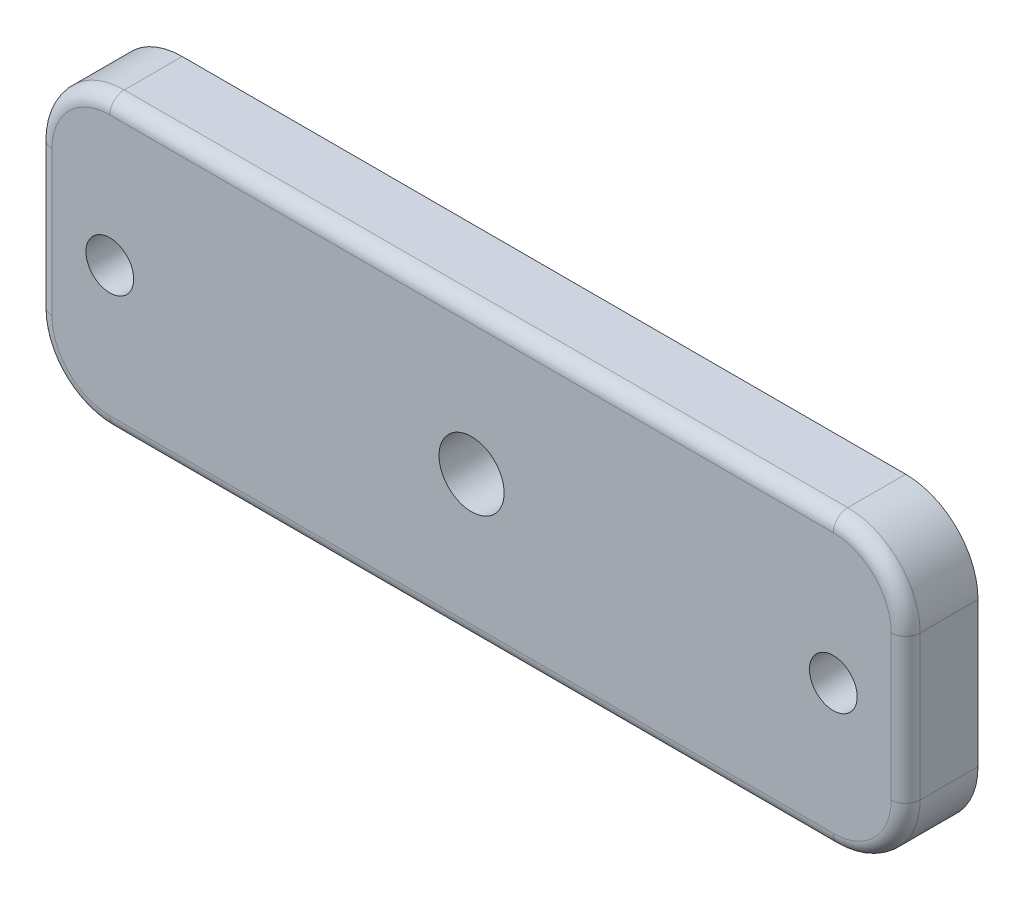
ISO-10303-21;
HEADER;
FILE_DESCRIPTION(('STEP AP214'),'2;1');
FILE_NAME('part.step','',(''),(''),'','','');
FILE_SCHEMA(('AUTOMOTIVE_DESIGN { 1 0 10303 214 1 1 1 1 }'));
ENDSEC;
DATA;
#1=APPLICATION_CONTEXT('core data for automotive mechanical design processes');
#2=APPLICATION_PROTOCOL_DEFINITION('international standard','automotive_design',2000,#1);
#3=PRODUCT_CONTEXT('',#1,'mechanical');
#4=PRODUCT('Part','Part','',(#3));
#5=PRODUCT_RELATED_PRODUCT_CATEGORY('part','',(#4));
#6=PRODUCT_DEFINITION_FORMATION('','',#4);
#7=PRODUCT_DEFINITION_CONTEXT('part definition',#1,'design');
#8=PRODUCT_DEFINITION('design','',#6,#7);
#9=PRODUCT_DEFINITION_SHAPE('','',#8);
#10=(LENGTH_UNIT() NAMED_UNIT(*) SI_UNIT(.MILLI.,.METRE.));
#11=(NAMED_UNIT(*) PLANE_ANGLE_UNIT() SI_UNIT($,.RADIAN.));
#12=(NAMED_UNIT(*) SI_UNIT($,.STERADIAN.) SOLID_ANGLE_UNIT());
#13=UNCERTAINTY_MEASURE_WITH_UNIT(LENGTH_MEASURE(1.E-05),#10,'distance_accuracy_value','');
#14=(GEOMETRIC_REPRESENTATION_CONTEXT(3) GLOBAL_UNCERTAINTY_ASSIGNED_CONTEXT((#13)) GLOBAL_UNIT_ASSIGNED_CONTEXT((#10,
#11,#12)) REPRESENTATION_CONTEXT('',''));
#15=CARTESIAN_POINT('',(0.,0.,0.));
#16=DIRECTION('',(0.,0.,1.));
#17=DIRECTION('',(1.,0.,0.));
#18=AXIS2_PLACEMENT_3D('',#15,#16,#17);
#19=CARTESIAN_POINT('',(0.,0.,5.));
#20=DIRECTION('',(0.,0.,-1.));
#21=DIRECTION('',(-1.,0.,0.));
#22=AXIS2_PLACEMENT_3D('',#19,#20,#21);
#23=PLANE('',#22);
#24=CARTESIAN_POINT('',(0.,-10.,5.));
#25=DIRECTION('',(0.,0.,1.));
#26=DIRECTION('',(1.,0.,0.));
#27=AXIS2_PLACEMENT_3D('',#24,#25,#26);
#28=CIRCLE('',#27,2.25);
#29=CARTESIAN_POINT('',(2.25,-10.,5.));
#30=VERTEX_POINT('',#29);
#31=EDGE_CURVE('E325',#30,#30,#28,.T.);
#32=ORIENTED_EDGE('',*,*,#31,.F.);
#33=EDGE_LOOP('',(#32));
#34=FACE_BOUND('',#33,.T.);
#35=CARTESIAN_POINT('',(25.,-10.,5.));
#36=DIRECTION('',(0.,0.,1.));
#37=DIRECTION('',(1.,0.,0.));
#38=AXIS2_PLACEMENT_3D('',#35,#36,#37);
#39=CIRCLE('',#38,1.65);
#40=CARTESIAN_POINT('',(26.65,-10.,5.));
#41=VERTEX_POINT('',#40);
#42=EDGE_CURVE('E332',#41,#41,#39,.T.);
#43=ORIENTED_EDGE('',*,*,#42,.F.);
#44=EDGE_LOOP('',(#43));
#45=FACE_BOUND('',#44,.T.);
#46=CARTESIAN_POINT('',(-25.,-10.,5.));
#47=DIRECTION('',(0.,0.,1.));
#48=DIRECTION('',(1.,0.,0.));
#49=AXIS2_PLACEMENT_3D('',#46,#47,#48);
#50=CIRCLE('',#49,1.65);
#51=CARTESIAN_POINT('',(-23.35,-10.,5.));
#52=VERTEX_POINT('',#51);
#53=EDGE_CURVE('E337',#52,#52,#50,.T.);
#54=ORIENTED_EDGE('',*,*,#53,.F.);
#55=EDGE_LOOP('',(#54));
#56=FACE_BOUND('',#55,.T.);
#57=CARTESIAN_POINT('',(25.,-4.99999999999999,5.));
#58=DIRECTION('',(0.,0.,-1.));
#59=DIRECTION('',(-1.,0.,0.));
#60=AXIS2_PLACEMENT_3D('',#57,#58,#59);
#61=CIRCLE('',#60,4.);
#62=CARTESIAN_POINT('',(25.,-0.99999999999999,5.));
#63=VERTEX_POINT('',#62);
#64=CARTESIAN_POINT('',(29.,-4.99999999999999,5.));
#65=VERTEX_POINT('',#64);
#66=EDGE_CURVE('E244',#63,#65,#61,.T.);
#67=ORIENTED_EDGE('',*,*,#66,.F.);
#68=DIRECTION('',(-1.,0.,0.));
#69=VECTOR('',#68,1.);
#70=CARTESIAN_POINT('',(0.,-0.999999999999995,5.));
#71=LINE('',#70,#69);
#72=CARTESIAN_POINT('',(-25.,-0.999999999999999,5.));
#73=VERTEX_POINT('',#72);
#74=EDGE_CURVE('E139',#63,#73,#71,.T.);
#75=ORIENTED_EDGE('',*,*,#74,.T.);
#76=CARTESIAN_POINT('',(-25.,-5.,5.));
#77=DIRECTION('',(0.,0.,-1.));
#78=DIRECTION('',(-1.,0.,0.));
#79=AXIS2_PLACEMENT_3D('',#76,#77,#78);
#80=CIRCLE('',#79,4.);
#81=CARTESIAN_POINT('',(-29.,-5.,5.));
#82=VERTEX_POINT('',#81);
#83=EDGE_CURVE('E134',#82,#73,#80,.T.);
#84=ORIENTED_EDGE('',*,*,#83,.F.);
#85=DIRECTION('',(0.,-1.,0.));
#86=VECTOR('',#85,1.);
#87=CARTESIAN_POINT('',(-29.,0.,5.));
#88=LINE('',#87,#86);
#89=CARTESIAN_POINT('',(-29.,-15.,5.));
#90=VERTEX_POINT('',#89);
#91=EDGE_CURVE('E137',#82,#90,#88,.T.);
#92=ORIENTED_EDGE('',*,*,#91,.T.);
#93=CARTESIAN_POINT('',(-25.,-15.,5.));
#94=DIRECTION('',(0.,0.,-1.));
#95=DIRECTION('',(-1.,0.,0.));
#96=AXIS2_PLACEMENT_3D('',#93,#94,#95);
#97=CIRCLE('',#96,4.);
#98=CARTESIAN_POINT('',(-25.,-19.,5.));
#99=VERTEX_POINT('',#98);
#100=EDGE_CURVE('E144',#99,#90,#97,.T.);
#101=ORIENTED_EDGE('',*,*,#100,.F.);
#102=DIRECTION('',(1.,0.,0.));
#103=VECTOR('',#102,1.);
#104=CARTESIAN_POINT('',(0.,-19.,5.));
#105=LINE('',#104,#103);
#106=CARTESIAN_POINT('',(25.,-19.,5.));
#107=VERTEX_POINT('',#106);
#108=EDGE_CURVE('E155',#99,#107,#105,.T.);
#109=ORIENTED_EDGE('',*,*,#108,.T.);
#110=CARTESIAN_POINT('',(25.,-15.,5.));
#111=DIRECTION('',(0.,0.,-1.));
#112=DIRECTION('',(-1.,0.,0.));
#113=AXIS2_PLACEMENT_3D('',#110,#111,#112);
#114=CIRCLE('',#113,4.);
#115=CARTESIAN_POINT('',(29.,-15.,5.));
#116=VERTEX_POINT('',#115);
#117=EDGE_CURVE('E241',#116,#107,#114,.T.);
#118=ORIENTED_EDGE('',*,*,#117,.F.);
#119=DIRECTION('',(0.,1.,0.));
#120=VECTOR('',#119,1.);
#121=CARTESIAN_POINT('',(29.,0.,5.));
#122=LINE('',#121,#120);
#123=EDGE_CURVE('E221',#116,#65,#122,.T.);
#124=ORIENTED_EDGE('',*,*,#123,.T.);
#125=EDGE_LOOP('',(#67,#75,#84,#92,#101,#109,#118,#124));
#126=FACE_BOUND('',#125,.T.);
#127=ADVANCED_FACE('F42',(#34,#45,#56,#126),#23,.F.);
#128=CARTESIAN_POINT('',(0.,0.,0.));
#129=DIRECTION('',(0.,0.,-1.));
#130=DIRECTION('',(-1.,0.,0.));
#131=AXIS2_PLACEMENT_3D('',#128,#129,#130);
#132=PLANE('',#131);
#133=CARTESIAN_POINT('',(25.,-10.,0.));
#134=DIRECTION('',(0.,0.,1.));
#135=DIRECTION('',(1.,0.,0.));
#136=AXIS2_PLACEMENT_3D('',#133,#134,#135);
#137=CIRCLE('',#136,1.65);
#138=CARTESIAN_POINT('',(26.65,-10.,0.));
#139=VERTEX_POINT('',#138);
#140=EDGE_CURVE('E334',#139,#139,#137,.T.);
#141=ORIENTED_EDGE('',*,*,#140,.T.);
#142=EDGE_LOOP('',(#141));
#143=FACE_BOUND('',#142,.T.);
#144=DIRECTION('',(0.,-1.,0.));
#145=VECTOR('',#144,1.);
#146=CARTESIAN_POINT('',(-30.,0.,0.));
#147=LINE('',#146,#145);
#148=CARTESIAN_POINT('',(-30.,-5.,0.));
#149=VERTEX_POINT('',#148);
#150=CARTESIAN_POINT('',(-30.,-15.,0.));
#151=VERTEX_POINT('',#150);
#152=EDGE_CURVE('E222',#149,#151,#147,.T.);
#153=ORIENTED_EDGE('',*,*,#152,.F.);
#154=CARTESIAN_POINT('',(-25.,-5.,0.));
#155=DIRECTION('',(0.,0.,-1.));
#156=DIRECTION('',(-1.,0.,0.));
#157=AXIS2_PLACEMENT_3D('',#154,#155,#156);
#158=CIRCLE('',#157,5.);
#159=CARTESIAN_POINT('',(-25.,0.,0.));
#160=VERTEX_POINT('',#159);
#161=EDGE_CURVE('E59',#149,#160,#158,.T.);
#162=ORIENTED_EDGE('',*,*,#161,.T.);
#163=DIRECTION('',(-1.,0.,0.));
#164=VECTOR('',#163,1.);
#165=CARTESIAN_POINT('',(-30.,0.,0.));
#166=LINE('',#165,#164);
#167=CARTESIAN_POINT('',(25.,0.,0.));
#168=VERTEX_POINT('',#167);
#169=EDGE_CURVE('E226',#168,#160,#166,.T.);
#170=ORIENTED_EDGE('',*,*,#169,.F.);
#171=CARTESIAN_POINT('',(25.,-4.99999999999999,0.));
#172=DIRECTION('',(0.,0.,-1.));
#173=DIRECTION('',(-1.,0.,0.));
#174=AXIS2_PLACEMENT_3D('',#171,#172,#173);
#175=CIRCLE('',#174,5.);
#176=CARTESIAN_POINT('',(30.,-4.99999999999999,0.));
#177=VERTEX_POINT('',#176);
#178=EDGE_CURVE('E175',#168,#177,#175,.T.);
#179=ORIENTED_EDGE('',*,*,#178,.T.);
#180=DIRECTION('',(0.,1.,0.));
#181=VECTOR('',#180,1.);
#182=CARTESIAN_POINT('',(30.,-20.,0.));
#183=LINE('',#182,#181);
#184=CARTESIAN_POINT('',(30.,-15.,0.));
#185=VERTEX_POINT('',#184);
#186=EDGE_CURVE('E324',#185,#177,#183,.T.);
#187=ORIENTED_EDGE('',*,*,#186,.F.);
#188=CARTESIAN_POINT('',(25.,-15.,0.));
#189=DIRECTION('',(0.,0.,-1.));
#190=DIRECTION('',(-1.,0.,0.));
#191=AXIS2_PLACEMENT_3D('',#188,#189,#190);
#192=CIRCLE('',#191,5.);
#193=CARTESIAN_POINT('',(25.,-20.,0.));
#194=VERTEX_POINT('',#193);
#195=EDGE_CURVE('E177',#185,#194,#192,.T.);
#196=ORIENTED_EDGE('',*,*,#195,.T.);
#197=DIRECTION('',(1.,0.,0.));
#198=VECTOR('',#197,1.);
#199=CARTESIAN_POINT('',(-30.,-20.,0.));
#200=LINE('',#199,#198);
#201=CARTESIAN_POINT('',(-25.,-20.,0.));
#202=VERTEX_POINT('',#201);
#203=EDGE_CURVE('E212',#202,#194,#200,.T.);
#204=ORIENTED_EDGE('',*,*,#203,.F.);
#205=CARTESIAN_POINT('',(-25.,-15.,0.));
#206=DIRECTION('',(0.,0.,-1.));
#207=DIRECTION('',(-1.,0.,0.));
#208=AXIS2_PLACEMENT_3D('',#205,#206,#207);
#209=CIRCLE('',#208,5.);
#210=EDGE_CURVE('E179',#202,#151,#209,.T.);
#211=ORIENTED_EDGE('',*,*,#210,.T.);
#212=EDGE_LOOP('',(#153,#162,#170,#179,#187,#196,#204,#211));
#213=FACE_BOUND('',#212,.T.);
#214=CARTESIAN_POINT('',(0.,-10.,0.));
#215=DIRECTION('',(0.,0.,1.));
#216=DIRECTION('',(1.,0.,0.));
#217=AXIS2_PLACEMENT_3D('',#214,#215,#216);
#218=CIRCLE('',#217,2.25);
#219=CARTESIAN_POINT('',(2.25,-10.,0.));
#220=VERTEX_POINT('',#219);
#221=EDGE_CURVE('E328',#220,#220,#218,.T.);
#222=ORIENTED_EDGE('',*,*,#221,.T.);
#223=EDGE_LOOP('',(#222));
#224=FACE_BOUND('',#223,.T.);
#225=CARTESIAN_POINT('',(-25.,-10.,0.));
#226=DIRECTION('',(0.,0.,1.));
#227=DIRECTION('',(1.,0.,0.));
#228=AXIS2_PLACEMENT_3D('',#225,#226,#227);
#229=CIRCLE('',#228,1.65);
#230=CARTESIAN_POINT('',(-23.35,-10.,0.));
#231=VERTEX_POINT('',#230);
#232=EDGE_CURVE('E193',#231,#231,#229,.T.);
#233=ORIENTED_EDGE('',*,*,#232,.T.);
#234=EDGE_LOOP('',(#233));
#235=FACE_BOUND('',#234,.T.);
#236=ADVANCED_FACE('F216',(#143,#213,#224,#235),#132,.T.);
#237=CARTESIAN_POINT('',(30.,-20.,5.));
#238=DIRECTION('',(-1.,0.,0.));
#239=DIRECTION('',(0.,0.,1.));
#240=AXIS2_PLACEMENT_3D('',#237,#238,#239);
#241=PLANE('',#240);
#242=DIRECTION('',(0.,1.,0.));
#243=VECTOR('',#242,1.);
#244=CARTESIAN_POINT('',(30.,-20.,4.));
#245=LINE('',#244,#243);
#246=CARTESIAN_POINT('',(30.,-4.99999999999999,4.));
#247=VERTEX_POINT('',#246);
#248=CARTESIAN_POINT('',(30.,-15.,4.));
#249=VERTEX_POINT('',#248);
#250=EDGE_CURVE('E145',#247,#249,#245,.F.);
#251=ORIENTED_EDGE('',*,*,#250,.T.);
#252=DIRECTION('',(0.,0.,-1.));
#253=VECTOR('',#252,1.);
#254=CARTESIAN_POINT('',(30.,-15.,5.));
#255=LINE('',#254,#253);
#256=EDGE_CURVE('E11',#249,#185,#255,.T.);
#257=ORIENTED_EDGE('',*,*,#256,.T.);
#258=ORIENTED_EDGE('',*,*,#186,.T.);
#259=DIRECTION('',(0.,0.,-1.));
#260=VECTOR('',#259,1.);
#261=CARTESIAN_POINT('',(30.,-4.99999999999999,5.));
#262=LINE('',#261,#260);
#263=EDGE_CURVE('E51',#177,#247,#262,.F.);
#264=ORIENTED_EDGE('',*,*,#263,.T.);
#265=EDGE_LOOP('',(#251,#257,#258,#264));
#266=FACE_BOUND('',#265,.T.);
#267=ADVANCED_FACE('F265',(#266),#241,.F.);
#268=CARTESIAN_POINT('',(-30.,0.,5.));
#269=DIRECTION('',(0.,-1.,0.));
#270=DIRECTION('',(1.,0.,0.));
#271=AXIS2_PLACEMENT_3D('',#268,#269,#270);
#272=PLANE('',#271);
#273=ORIENTED_EDGE('',*,*,#169,.T.);
#274=DIRECTION('',(0.,0.,-1.));
#275=VECTOR('',#274,1.);
#276=CARTESIAN_POINT('',(-25.,0.,5.));
#277=LINE('',#276,#275);
#278=CARTESIAN_POINT('',(-25.,0.,4.));
#279=VERTEX_POINT('',#278);
#280=EDGE_CURVE('E183',#160,#279,#277,.F.);
#281=ORIENTED_EDGE('',*,*,#280,.T.);
#282=DIRECTION('',(-1.,0.,0.));
#283=VECTOR('',#282,1.);
#284=CARTESIAN_POINT('',(-30.,0.,4.));
#285=LINE('',#284,#283);
#286=CARTESIAN_POINT('',(25.,0.,4.));
#287=VERTEX_POINT('',#286);
#288=EDGE_CURVE('E236',#279,#287,#285,.F.);
#289=ORIENTED_EDGE('',*,*,#288,.T.);
#290=DIRECTION('',(0.,0.,-1.));
#291=VECTOR('',#290,1.);
#292=CARTESIAN_POINT('',(25.,0.,5.));
#293=LINE('',#292,#291);
#294=EDGE_CURVE('E66',#287,#168,#293,.T.);
#295=ORIENTED_EDGE('',*,*,#294,.T.);
#296=EDGE_LOOP('',(#273,#281,#289,#295));
#297=FACE_BOUND('',#296,.T.);
#298=ADVANCED_FACE('F302',(#297),#272,.F.);
#299=CARTESIAN_POINT('',(-30.,0.,5.));
#300=DIRECTION('',(1.,0.,0.));
#301=DIRECTION('',(0.,1.,0.));
#302=AXIS2_PLACEMENT_3D('',#299,#300,#301);
#303=PLANE('',#302);
#304=DIRECTION('',(0.,-1.,0.));
#305=VECTOR('',#304,1.);
#306=CARTESIAN_POINT('',(-30.,0.,4.));
#307=LINE('',#306,#305);
#308=CARTESIAN_POINT('',(-30.,-15.,4.));
#309=VERTEX_POINT('',#308);
#310=CARTESIAN_POINT('',(-30.,-5.,4.));
#311=VERTEX_POINT('',#310);
#312=EDGE_CURVE('E234',#309,#311,#307,.F.);
#313=ORIENTED_EDGE('',*,*,#312,.T.);
#314=DIRECTION('',(0.,0.,-1.));
#315=VECTOR('',#314,1.);
#316=CARTESIAN_POINT('',(-30.,-5.,5.));
#317=LINE('',#316,#315);
#318=EDGE_CURVE('E173',#311,#149,#317,.T.);
#319=ORIENTED_EDGE('',*,*,#318,.T.);
#320=ORIENTED_EDGE('',*,*,#152,.T.);
#321=DIRECTION('',(0.,0.,-1.));
#322=VECTOR('',#321,1.);
#323=CARTESIAN_POINT('',(-30.,-15.,5.));
#324=LINE('',#323,#322);
#325=EDGE_CURVE('E171',#151,#309,#324,.F.);
#326=ORIENTED_EDGE('',*,*,#325,.T.);
#327=EDGE_LOOP('',(#313,#319,#320,#326));
#328=FACE_BOUND('',#327,.T.);
#329=ADVANCED_FACE('F299',(#328),#303,.F.);
#330=CARTESIAN_POINT('',(-30.,-20.,5.));
#331=DIRECTION('',(0.,1.,0.));
#332=DIRECTION('',(-1.,0.,0.));
#333=AXIS2_PLACEMENT_3D('',#330,#331,#332);
#334=PLANE('',#333);
#335=DIRECTION('',(1.,0.,0.));
#336=VECTOR('',#335,1.);
#337=CARTESIAN_POINT('',(-30.,-20.,4.));
#338=LINE('',#337,#336);
#339=CARTESIAN_POINT('',(25.,-20.,4.));
#340=VERTEX_POINT('',#339);
#341=CARTESIAN_POINT('',(-25.,-20.,4.));
#342=VERTEX_POINT('',#341);
#343=EDGE_CURVE('E215',#340,#342,#338,.F.);
#344=ORIENTED_EDGE('',*,*,#343,.T.);
#345=DIRECTION('',(0.,0.,-1.));
#346=VECTOR('',#345,1.);
#347=CARTESIAN_POINT('',(-25.,-20.,5.));
#348=LINE('',#347,#346);
#349=EDGE_CURVE('E187',#342,#202,#348,.T.);
#350=ORIENTED_EDGE('',*,*,#349,.T.);
#351=ORIENTED_EDGE('',*,*,#203,.T.);
#352=DIRECTION('',(0.,0.,-1.));
#353=VECTOR('',#352,1.);
#354=CARTESIAN_POINT('',(25.,-20.,5.));
#355=LINE('',#354,#353);
#356=EDGE_CURVE('E185',#194,#340,#355,.F.);
#357=ORIENTED_EDGE('',*,*,#356,.T.);
#358=EDGE_LOOP('',(#344,#350,#351,#357));
#359=FACE_BOUND('',#358,.T.);
#360=ADVANCED_FACE('F211',(#359),#334,.F.);
#361=CARTESIAN_POINT('',(0.,-10.,5.));
#362=DIRECTION('',(0.,0.,-1.));
#363=DIRECTION('',(-1.,0.,0.));
#364=AXIS2_PLACEMENT_3D('',#361,#362,#363);
#365=CYLINDRICAL_SURFACE('',#364,2.25);
#366=ORIENTED_EDGE('',*,*,#31,.T.);
#367=EDGE_LOOP('',(#366));
#368=FACE_BOUND('',#367,.T.);
#369=ORIENTED_EDGE('',*,*,#221,.F.);
#370=EDGE_LOOP('',(#369));
#371=FACE_BOUND('',#370,.T.);
#372=ADVANCED_FACE('F294',(#368,#371),#365,.F.);
#373=CARTESIAN_POINT('',(25.,-10.,5.));
#374=DIRECTION('',(0.,0.,-1.));
#375=DIRECTION('',(-1.,0.,0.));
#376=AXIS2_PLACEMENT_3D('',#373,#374,#375);
#377=CYLINDRICAL_SURFACE('',#376,1.65);
#378=ORIENTED_EDGE('',*,*,#42,.T.);
#379=EDGE_LOOP('',(#378));
#380=FACE_BOUND('',#379,.T.);
#381=ORIENTED_EDGE('',*,*,#140,.F.);
#382=EDGE_LOOP('',(#381));
#383=FACE_BOUND('',#382,.T.);
#384=ADVANCED_FACE('F347',(#380,#383),#377,.F.);
#385=CARTESIAN_POINT('',(-25.,-10.,5.));
#386=DIRECTION('',(0.,0.,-1.));
#387=DIRECTION('',(-1.,0.,0.));
#388=AXIS2_PLACEMENT_3D('',#385,#386,#387);
#389=CYLINDRICAL_SURFACE('',#388,1.65);
#390=ORIENTED_EDGE('',*,*,#53,.T.);
#391=EDGE_LOOP('',(#390));
#392=FACE_BOUND('',#391,.T.);
#393=ORIENTED_EDGE('',*,*,#232,.F.);
#394=EDGE_LOOP('',(#393));
#395=FACE_BOUND('',#394,.T.);
#396=ADVANCED_FACE('F316',(#392,#395),#389,.F.);
#397=CARTESIAN_POINT('',(0.,-0.999999999999995,4.));
#398=DIRECTION('',(-1.,0.,0.));
#399=DIRECTION('',(0.,-1.,0.));
#400=AXIS2_PLACEMENT_3D('',#397,#398,#399);
#401=CYLINDRICAL_SURFACE('',#400,1.);
#402=ORIENTED_EDGE('',*,*,#288,.F.);
#403=CARTESIAN_POINT('',(-25.,-0.999999999999999,4.));
#404=DIRECTION('',(1.,0.,0.));
#405=DIRECTION('',(0.,0.,-1.));
#406=AXIS2_PLACEMENT_3D('',#403,#404,#405);
#407=CIRCLE('',#406,1.);
#408=EDGE_CURVE('E169',#279,#73,#407,.T.);
#409=ORIENTED_EDGE('',*,*,#408,.T.);
#410=ORIENTED_EDGE('',*,*,#74,.F.);
#411=CARTESIAN_POINT('',(25.,-0.99999999999999,4.));
#412=DIRECTION('',(-1.,0.,0.));
#413=DIRECTION('',(0.,0.,1.));
#414=AXIS2_PLACEMENT_3D('',#411,#412,#413);
#415=CIRCLE('',#414,1.);
#416=EDGE_CURVE('E162',#63,#287,#415,.T.);
#417=ORIENTED_EDGE('',*,*,#416,.T.);
#418=EDGE_LOOP('',(#402,#409,#410,#417));
#419=FACE_BOUND('',#418,.T.);
#420=ADVANCED_FACE('F314',(#419),#401,.T.);
#421=CARTESIAN_POINT('',(-29.,0.,4.));
#422=DIRECTION('',(0.,-1.,0.));
#423=DIRECTION('',(1.,0.,0.));
#424=AXIS2_PLACEMENT_3D('',#421,#422,#423);
#425=CYLINDRICAL_SURFACE('',#424,1.);
#426=ORIENTED_EDGE('',*,*,#312,.F.);
#427=CARTESIAN_POINT('',(-29.,-15.,4.));
#428=DIRECTION('',(0.,1.,0.));
#429=DIRECTION('',(0.,0.,1.));
#430=AXIS2_PLACEMENT_3D('',#427,#428,#429);
#431=CIRCLE('',#430,1.);
#432=EDGE_CURVE('E154',#309,#90,#431,.T.);
#433=ORIENTED_EDGE('',*,*,#432,.T.);
#434=ORIENTED_EDGE('',*,*,#91,.F.);
#435=CARTESIAN_POINT('',(-29.,-5.,4.));
#436=DIRECTION('',(0.,-1.,0.));
#437=DIRECTION('',(0.,0.,-1.));
#438=AXIS2_PLACEMENT_3D('',#435,#436,#437);
#439=CIRCLE('',#438,1.);
#440=EDGE_CURVE('E151',#82,#311,#439,.T.);
#441=ORIENTED_EDGE('',*,*,#440,.T.);
#442=EDGE_LOOP('',(#426,#433,#434,#441));
#443=FACE_BOUND('',#442,.T.);
#444=ADVANCED_FACE('F150',(#443),#425,.T.);
#445=CARTESIAN_POINT('',(29.,0.,4.));
#446=DIRECTION('',(0.,1.,0.));
#447=DIRECTION('',(0.,0.,1.));
#448=AXIS2_PLACEMENT_3D('',#445,#446,#447);
#449=CYLINDRICAL_SURFACE('',#448,1.);
#450=ORIENTED_EDGE('',*,*,#250,.F.);
#451=CARTESIAN_POINT('',(29.,-4.99999999999999,4.));
#452=DIRECTION('',(0.,-1.,0.));
#453=DIRECTION('',(0.,0.,-1.));
#454=AXIS2_PLACEMENT_3D('',#451,#452,#453);
#455=CIRCLE('',#454,1.);
#456=EDGE_CURVE('E249',#247,#65,#455,.T.);
#457=ORIENTED_EDGE('',*,*,#456,.T.);
#458=ORIENTED_EDGE('',*,*,#123,.F.);
#459=CARTESIAN_POINT('',(29.,-15.,4.));
#460=DIRECTION('',(0.,1.,0.));
#461=DIRECTION('',(0.,0.,1.));
#462=AXIS2_PLACEMENT_3D('',#459,#460,#461);
#463=CIRCLE('',#462,1.);
#464=EDGE_CURVE('E247',#116,#249,#463,.T.);
#465=ORIENTED_EDGE('',*,*,#464,.T.);
#466=EDGE_LOOP('',(#450,#457,#458,#465));
#467=FACE_BOUND('',#466,.T.);
#468=ADVANCED_FACE('F261',(#467),#449,.T.);
#469=CARTESIAN_POINT('',(0.,-19.,4.));
#470=DIRECTION('',(1.,0.,0.));
#471=DIRECTION('',(0.,1.,0.));
#472=AXIS2_PLACEMENT_3D('',#469,#470,#471);
#473=CYLINDRICAL_SURFACE('',#472,1.);
#474=ORIENTED_EDGE('',*,*,#343,.F.);
#475=CARTESIAN_POINT('',(25.,-19.,4.));
#476=DIRECTION('',(-1.,0.,0.));
#477=DIRECTION('',(0.,0.,1.));
#478=AXIS2_PLACEMENT_3D('',#475,#476,#477);
#479=CIRCLE('',#478,1.);
#480=EDGE_CURVE('E160',#340,#107,#479,.T.);
#481=ORIENTED_EDGE('',*,*,#480,.T.);
#482=ORIENTED_EDGE('',*,*,#108,.F.);
#483=CARTESIAN_POINT('',(-25.,-19.,4.));
#484=DIRECTION('',(1.,0.,0.));
#485=DIRECTION('',(0.,0.,-1.));
#486=AXIS2_PLACEMENT_3D('',#483,#484,#485);
#487=CIRCLE('',#486,1.);
#488=EDGE_CURVE('E164',#99,#342,#487,.T.);
#489=ORIENTED_EDGE('',*,*,#488,.T.);
#490=EDGE_LOOP('',(#474,#481,#482,#489));
#491=FACE_BOUND('',#490,.T.);
#492=ADVANCED_FACE('F252',(#491),#473,.T.);
#493=CARTESIAN_POINT('',(25.,-4.99999999999999,5.));
#494=DIRECTION('',(0.,0.,-1.));
#495=DIRECTION('',(-1.,0.,0.));
#496=AXIS2_PLACEMENT_3D('',#493,#494,#495);
#497=CYLINDRICAL_SURFACE('',#496,5.);
#498=ORIENTED_EDGE('',*,*,#178,.F.);
#499=ORIENTED_EDGE('',*,*,#294,.F.);
#500=CARTESIAN_POINT('',(25.,-4.99999999999999,4.));
#501=DIRECTION('',(0.,0.,-1.));
#502=DIRECTION('',(-1.,0.,0.));
#503=AXIS2_PLACEMENT_3D('',#500,#501,#502);
#504=CIRCLE('',#503,5.);
#505=EDGE_CURVE('E190',#247,#287,#504,.F.);
#506=ORIENTED_EDGE('',*,*,#505,.F.);
#507=ORIENTED_EDGE('',*,*,#263,.F.);
#508=EDGE_LOOP('',(#498,#499,#506,#507));
#509=FACE_BOUND('',#508,.T.);
#510=ADVANCED_FACE('F278',(#509),#497,.T.);
#511=CARTESIAN_POINT('',(25.,-4.99999999999999,4.));
#512=DIRECTION('',(0.,0.,-1.));
#513=DIRECTION('',(-1.,0.,0.));
#514=AXIS2_PLACEMENT_3D('',#511,#512,#513);
#515=TOROIDAL_SURFACE('',#514,4.,1.);
#516=ORIENTED_EDGE('',*,*,#416,.F.);
#517=ORIENTED_EDGE('',*,*,#66,.T.);
#518=ORIENTED_EDGE('',*,*,#456,.F.);
#519=ORIENTED_EDGE('',*,*,#505,.T.);
#520=EDGE_LOOP('',(#516,#517,#518,#519));
#521=FACE_BOUND('',#520,.T.);
#522=ADVANCED_FACE('F271',(#521),#515,.T.);
#523=CARTESIAN_POINT('',(25.,-15.,5.));
#524=DIRECTION('',(0.,0.,-1.));
#525=DIRECTION('',(-1.,0.,0.));
#526=AXIS2_PLACEMENT_3D('',#523,#524,#525);
#527=CYLINDRICAL_SURFACE('',#526,5.);
#528=ORIENTED_EDGE('',*,*,#195,.F.);
#529=ORIENTED_EDGE('',*,*,#256,.F.);
#530=CARTESIAN_POINT('',(25.,-15.,4.));
#531=DIRECTION('',(0.,0.,-1.));
#532=DIRECTION('',(-1.,0.,0.));
#533=AXIS2_PLACEMENT_3D('',#530,#531,#532);
#534=CIRCLE('',#533,5.);
#535=EDGE_CURVE('E194',#340,#249,#534,.F.);
#536=ORIENTED_EDGE('',*,*,#535,.F.);
#537=ORIENTED_EDGE('',*,*,#356,.F.);
#538=EDGE_LOOP('',(#528,#529,#536,#537));
#539=FACE_BOUND('',#538,.T.);
#540=ADVANCED_FACE('F269',(#539),#527,.T.);
#541=CARTESIAN_POINT('',(25.,-15.,4.));
#542=DIRECTION('',(0.,0.,-1.));
#543=DIRECTION('',(-1.,0.,0.));
#544=AXIS2_PLACEMENT_3D('',#541,#542,#543);
#545=TOROIDAL_SURFACE('',#544,4.,1.);
#546=ORIENTED_EDGE('',*,*,#464,.F.);
#547=ORIENTED_EDGE('',*,*,#117,.T.);
#548=ORIENTED_EDGE('',*,*,#480,.F.);
#549=ORIENTED_EDGE('',*,*,#535,.T.);
#550=EDGE_LOOP('',(#546,#547,#548,#549));
#551=FACE_BOUND('',#550,.T.);
#552=ADVANCED_FACE('F258',(#551),#545,.T.);
#553=CARTESIAN_POINT('',(-25.,-15.,5.));
#554=DIRECTION('',(0.,0.,-1.));
#555=DIRECTION('',(-1.,0.,0.));
#556=AXIS2_PLACEMENT_3D('',#553,#554,#555);
#557=CYLINDRICAL_SURFACE('',#556,5.);
#558=ORIENTED_EDGE('',*,*,#210,.F.);
#559=ORIENTED_EDGE('',*,*,#349,.F.);
#560=CARTESIAN_POINT('',(-25.,-15.,4.));
#561=DIRECTION('',(0.,0.,-1.));
#562=DIRECTION('',(-1.,0.,0.));
#563=AXIS2_PLACEMENT_3D('',#560,#561,#562);
#564=CIRCLE('',#563,5.);
#565=EDGE_CURVE('E196',#309,#342,#564,.F.);
#566=ORIENTED_EDGE('',*,*,#565,.F.);
#567=ORIENTED_EDGE('',*,*,#325,.F.);
#568=EDGE_LOOP('',(#558,#559,#566,#567));
#569=FACE_BOUND('',#568,.T.);
#570=ADVANCED_FACE('F206',(#569),#557,.T.);
#571=CARTESIAN_POINT('',(-25.,-15.,4.));
#572=DIRECTION('',(0.,0.,-1.));
#573=DIRECTION('',(-1.,0.,0.));
#574=AXIS2_PLACEMENT_3D('',#571,#572,#573);
#575=TOROIDAL_SURFACE('',#574,4.,1.);
#576=ORIENTED_EDGE('',*,*,#432,.F.);
#577=ORIENTED_EDGE('',*,*,#565,.T.);
#578=ORIENTED_EDGE('',*,*,#488,.F.);
#579=ORIENTED_EDGE('',*,*,#100,.T.);
#580=EDGE_LOOP('',(#576,#577,#578,#579));
#581=FACE_BOUND('',#580,.T.);
#582=ADVANCED_FACE('F201',(#581),#575,.T.);
#583=CARTESIAN_POINT('',(-25.,-5.,5.));
#584=DIRECTION('',(0.,0.,-1.));
#585=DIRECTION('',(-1.,0.,0.));
#586=AXIS2_PLACEMENT_3D('',#583,#584,#585);
#587=CYLINDRICAL_SURFACE('',#586,5.);
#588=ORIENTED_EDGE('',*,*,#161,.F.);
#589=ORIENTED_EDGE('',*,*,#318,.F.);
#590=CARTESIAN_POINT('',(-25.,-5.,4.));
#591=DIRECTION('',(0.,0.,-1.));
#592=DIRECTION('',(-1.,0.,0.));
#593=AXIS2_PLACEMENT_3D('',#590,#591,#592);
#594=CIRCLE('',#593,5.);
#595=EDGE_CURVE('E46',#279,#311,#594,.F.);
#596=ORIENTED_EDGE('',*,*,#595,.F.);
#597=ORIENTED_EDGE('',*,*,#280,.F.);
#598=EDGE_LOOP('',(#588,#589,#596,#597));
#599=FACE_BOUND('',#598,.T.);
#600=ADVANCED_FACE('F44',(#599),#587,.T.);
#601=CARTESIAN_POINT('',(-25.,-5.,4.));
#602=DIRECTION('',(0.,0.,-1.));
#603=DIRECTION('',(-1.,0.,0.));
#604=AXIS2_PLACEMENT_3D('',#601,#602,#603);
#605=TOROIDAL_SURFACE('',#604,4.,1.);
#606=ORIENTED_EDGE('',*,*,#408,.F.);
#607=ORIENTED_EDGE('',*,*,#595,.T.);
#608=ORIENTED_EDGE('',*,*,#440,.F.);
#609=ORIENTED_EDGE('',*,*,#83,.T.);
#610=EDGE_LOOP('',(#606,#607,#608,#609));
#611=FACE_BOUND('',#610,.T.);
#612=ADVANCED_FACE('F158',(#611),#605,.T.);
#613=CLOSED_SHELL('',(#127,#236,#267,#298,#329,#360,#372,#384,#396,#420,#444,#468,#492,#510,
#522,#540,#552,#570,#582,#600,#612));
#614=MANIFOLD_SOLID_BREP('B2',#613);
#615=ADVANCED_BREP_SHAPE_REPRESENTATION('',(#18,#614),#14);
#616=SHAPE_DEFINITION_REPRESENTATION(#9,#615);
ENDSEC;
END-ISO-10303-21;
